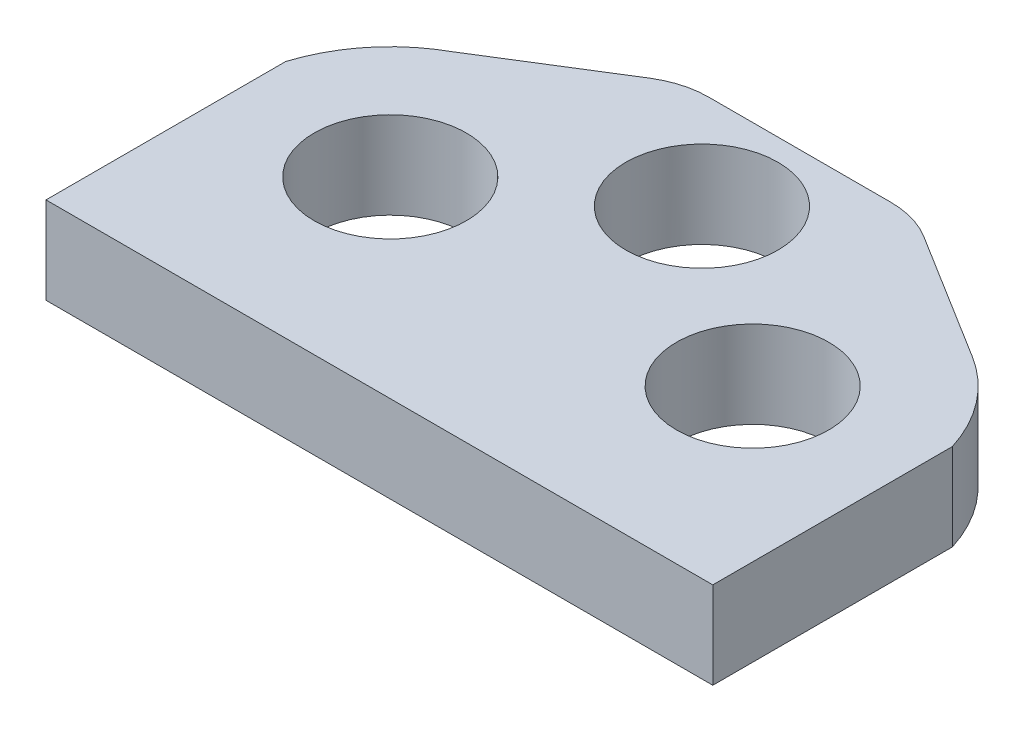
ISO-10303-21;
HEADER;
FILE_DESCRIPTION(('STEP AP214'),'2;1');
FILE_NAME('part.step','',(''),(''),'','','');
FILE_SCHEMA(('AUTOMOTIVE_DESIGN { 1 0 10303 214 1 1 1 1 }'));
ENDSEC;
DATA;
#1=APPLICATION_CONTEXT('core data for automotive mechanical design processes');
#2=APPLICATION_PROTOCOL_DEFINITION('international standard','automotive_design',2000,#1);
#3=PRODUCT_CONTEXT('',#1,'mechanical');
#4=PRODUCT('Part','Part','',(#3));
#5=PRODUCT_RELATED_PRODUCT_CATEGORY('part','',(#4));
#6=PRODUCT_DEFINITION_FORMATION('','',#4);
#7=PRODUCT_DEFINITION_CONTEXT('part definition',#1,'design');
#8=PRODUCT_DEFINITION('design','',#6,#7);
#9=PRODUCT_DEFINITION_SHAPE('','',#8);
#10=(LENGTH_UNIT() NAMED_UNIT(*) SI_UNIT(.MILLI.,.METRE.));
#11=(NAMED_UNIT(*) PLANE_ANGLE_UNIT() SI_UNIT($,.RADIAN.));
#12=(NAMED_UNIT(*) SI_UNIT($,.STERADIAN.) SOLID_ANGLE_UNIT());
#13=UNCERTAINTY_MEASURE_WITH_UNIT(LENGTH_MEASURE(1.E-05),#10,'distance_accuracy_value','');
#14=(GEOMETRIC_REPRESENTATION_CONTEXT(3) GLOBAL_UNCERTAINTY_ASSIGNED_CONTEXT((#13)) GLOBAL_UNIT_ASSIGNED_CONTEXT((#10,
#11,#12)) REPRESENTATION_CONTEXT('',''));
#15=CARTESIAN_POINT('',(0.,0.,0.));
#16=DIRECTION('',(0.,0.,1.));
#17=DIRECTION('',(1.,0.,0.));
#18=AXIS2_PLACEMENT_3D('',#15,#16,#17);
#19=CARTESIAN_POINT('',(46.,12.,-28.));
#20=DIRECTION('',(-1.,0.,0.));
#21=DIRECTION('',(0.,0.,1.));
#22=AXIS2_PLACEMENT_3D('',#19,#20,#21);
#23=PLANE('',#22);
#24=DIRECTION('',(0.,0.,-1.));
#25=VECTOR('',#24,1.);
#26=CARTESIAN_POINT('',(46.,0.,-28.));
#27=LINE('',#26,#25);
#28=CARTESIAN_POINT('',(46.,0.,28.));
#29=VERTEX_POINT('',#28);
#30=CARTESIAN_POINT('',(46.,0.,-5.05743852430174));
#31=VERTEX_POINT('',#30);
#32=EDGE_CURVE('E127',#29,#31,#27,.T.);
#33=ORIENTED_EDGE('',*,*,#32,.T.);
#34=DIRECTION('',(0.,1.,0.));
#35=VECTOR('',#34,1.);
#36=CARTESIAN_POINT('',(46.,-0.000999999999999265,-5.05743852430174));
#37=LINE('',#36,#35);
#38=CARTESIAN_POINT('',(46.,12.,-5.05743852430174));
#39=VERTEX_POINT('',#38);
#40=EDGE_CURVE('E109',#31,#39,#37,.T.);
#41=ORIENTED_EDGE('',*,*,#40,.T.);
#42=DIRECTION('',(0.,0.,-1.));
#43=VECTOR('',#42,1.);
#44=CARTESIAN_POINT('',(46.,12.,-28.));
#45=LINE('',#44,#43);
#46=CARTESIAN_POINT('',(46.,12.,28.));
#47=VERTEX_POINT('',#46);
#48=EDGE_CURVE('E146',#47,#39,#45,.T.);
#49=ORIENTED_EDGE('',*,*,#48,.F.);
#50=DIRECTION('',(0.,-1.,0.));
#51=VECTOR('',#50,1.);
#52=CARTESIAN_POINT('',(46.,12.,28.));
#53=LINE('',#52,#51);
#54=EDGE_CURVE('E133',#47,#29,#53,.T.);
#55=ORIENTED_EDGE('',*,*,#54,.T.);
#56=EDGE_LOOP('',(#33,#41,#49,#55));
#57=FACE_BOUND('',#56,.T.);
#58=ADVANCED_FACE('F32',(#57),#23,.F.);
#59=CARTESIAN_POINT('',(-46.,12.,-28.));
#60=DIRECTION('',(1.,0.,0.));
#61=DIRECTION('',(0.,0.,-1.));
#62=AXIS2_PLACEMENT_3D('',#59,#60,#61);
#63=PLANE('',#62);
#64=DIRECTION('',(0.,0.,1.));
#65=VECTOR('',#64,1.);
#66=CARTESIAN_POINT('',(-46.,12.,-28.));
#67=LINE('',#66,#65);
#68=CARTESIAN_POINT('',(-46.,12.,-5.05743852430096));
#69=VERTEX_POINT('',#68);
#70=CARTESIAN_POINT('',(-46.,12.,28.));
#71=VERTEX_POINT('',#70);
#72=EDGE_CURVE('E187',#69,#71,#67,.T.);
#73=ORIENTED_EDGE('',*,*,#72,.F.);
#74=DIRECTION('',(0.,1.,0.));
#75=VECTOR('',#74,1.);
#76=CARTESIAN_POINT('',(-46.,-0.000999999999999265,-5.05743852430096));
#77=LINE('',#76,#75);
#78=CARTESIAN_POINT('',(-46.,0.,-5.05743852430096));
#79=VERTEX_POINT('',#78);
#80=EDGE_CURVE('E200',#79,#69,#77,.T.);
#81=ORIENTED_EDGE('',*,*,#80,.F.);
#82=DIRECTION('',(0.,0.,1.));
#83=VECTOR('',#82,1.);
#84=CARTESIAN_POINT('',(-46.,0.,-28.));
#85=LINE('',#84,#83);
#86=CARTESIAN_POINT('',(-46.,0.,28.));
#87=VERTEX_POINT('',#86);
#88=EDGE_CURVE('E134',#79,#87,#85,.T.);
#89=ORIENTED_EDGE('',*,*,#88,.T.);
#90=DIRECTION('',(0.,-1.,0.));
#91=VECTOR('',#90,1.);
#92=CARTESIAN_POINT('',(-46.,12.,28.));
#93=LINE('',#92,#91);
#94=EDGE_CURVE('E148',#71,#87,#93,.T.);
#95=ORIENTED_EDGE('',*,*,#94,.F.);
#96=EDGE_LOOP('',(#73,#81,#89,#95));
#97=FACE_BOUND('',#96,.T.);
#98=ADVANCED_FACE('F199',(#97),#63,.F.);
#99=CARTESIAN_POINT('',(-46.,12.,28.));
#100=DIRECTION('',(0.,0.,-1.));
#101=DIRECTION('',(-1.,0.,0.));
#102=AXIS2_PLACEMENT_3D('',#99,#100,#101);
#103=PLANE('',#102);
#104=DIRECTION('',(1.,0.,0.));
#105=VECTOR('',#104,1.);
#106=CARTESIAN_POINT('',(-46.,0.,28.));
#107=LINE('',#106,#105);
#108=EDGE_CURVE('E137',#87,#29,#107,.T.);
#109=ORIENTED_EDGE('',*,*,#108,.T.);
#110=ORIENTED_EDGE('',*,*,#54,.F.);
#111=DIRECTION('',(1.,0.,0.));
#112=VECTOR('',#111,1.);
#113=CARTESIAN_POINT('',(-46.,12.,28.));
#114=LINE('',#113,#112);
#115=EDGE_CURVE('E142',#71,#47,#114,.T.);
#116=ORIENTED_EDGE('',*,*,#115,.F.);
#117=ORIENTED_EDGE('',*,*,#94,.T.);
#118=EDGE_LOOP('',(#109,#110,#116,#117));
#119=FACE_BOUND('',#118,.T.);
#120=ADVANCED_FACE('F193',(#119),#103,.F.);
#121=CARTESIAN_POINT('',(46.,12.,28.));
#122=DIRECTION('',(0.,1.,0.));
#123=DIRECTION('',(0.,0.,1.));
#124=AXIS2_PLACEMENT_3D('',#121,#122,#123);
#125=PLANE('',#124);
#126=CARTESIAN_POINT('',(0.,12.,-16.5));
#127=DIRECTION('',(0.,1.,0.));
#128=DIRECTION('',(0.,0.,1.));
#129=AXIS2_PLACEMENT_3D('',#126,#127,#128);
#130=CIRCLE('',#129,10.5);
#131=CARTESIAN_POINT('',(0.,12.,-5.99999999999999));
#132=VERTEX_POINT('',#131);
#133=EDGE_CURVE('E366',#132,#132,#130,.F.);
#134=ORIENTED_EDGE('',*,*,#133,.T.);
#135=EDGE_LOOP('',(#134));
#136=FACE_BOUND('',#135,.T.);
#137=DIRECTION('',(0.849261821281983,0.,0.527971930042506));
#138=VECTOR('',#137,1.);
#139=CARTESIAN_POINT('',(16.,12.,-30.));
#140=LINE('',#139,#138);
#141=CARTESIAN_POINT('',(18.9096133239769,12.,-28.1911418553838));
#142=VERTEX_POINT('',#141);
#143=CARTESIAN_POINT('',(36.6153824609372,12.,-17.1837600682023));
#144=VERTEX_POINT('',#143);
#145=EDGE_CURVE('E122',#142,#144,#140,.T.);
#146=ORIENTED_EDGE('',*,*,#145,.F.);
#147=CARTESIAN_POINT('',(12.5739501634669,12.,-18.));
#148=DIRECTION('',(0.,1.,0.));
#149=DIRECTION('',(0.,0.,1.));
#150=AXIS2_PLACEMENT_3D('',#147,#148,#149);
#151=CIRCLE('',#150,12.);
#152=CARTESIAN_POINT('',(12.5739501634669,12.,-30.));
#153=VERTEX_POINT('',#152);
#154=EDGE_CURVE('E156',#142,#153,#151,.T.);
#155=ORIENTED_EDGE('',*,*,#154,.T.);
#156=DIRECTION('',(-1.,0.,0.));
#157=VECTOR('',#156,1.);
#158=CARTESIAN_POINT('',(-46.,12.,-30.));
#159=LINE('',#158,#157);
#160=CARTESIAN_POINT('',(-12.56625423062,12.,-30.));
#161=VERTEX_POINT('',#160);
#162=EDGE_CURVE('E139',#153,#161,#159,.T.);
#163=ORIENTED_EDGE('',*,*,#162,.T.);
#164=CARTESIAN_POINT('',(-12.56625423062,12.,-18.));
#165=DIRECTION('',(0.,1.,0.));
#166=DIRECTION('',(0.,0.,1.));
#167=AXIS2_PLACEMENT_3D('',#164,#165,#166);
#168=CIRCLE('',#167,12.);
#169=CARTESIAN_POINT('',(-18.9139974067074,12.,-28.183621977));
#170=VERTEX_POINT('',#169);
#171=EDGE_CURVE('E154',#161,#170,#168,.T.);
#172=ORIENTED_EDGE('',*,*,#171,.T.);
#173=DIRECTION('',(0.848635164749995,0.,-0.52897859800728));
#174=VECTOR('',#173,1.);
#175=CARTESIAN_POINT('',(-16.,12.,-30.));
#176=LINE('',#175,#174);
#177=CARTESIAN_POINT('',(-35.6673041084861,12.,-17.740806195611));
#178=VERTEX_POINT('',#177);
#179=EDGE_CURVE('E208',#178,#170,#176,.T.);
#180=ORIENTED_EDGE('',*,*,#179,.F.);
#181=CARTESIAN_POINT('',(-25.,12.,1.5));
#182=DIRECTION('',(0.,-1.,0.));
#183=DIRECTION('',(0.,0.,-1.));
#184=AXIS2_PLACEMENT_3D('',#181,#182,#183);
#185=CIRCLE('',#184,21.9999999999997);
#186=EDGE_CURVE('E375',#69,#178,#185,.T.);
#187=ORIENTED_EDGE('',*,*,#186,.F.);
#188=ORIENTED_EDGE('',*,*,#72,.T.);
#189=ORIENTED_EDGE('',*,*,#115,.T.);
#190=ORIENTED_EDGE('',*,*,#48,.T.);
#191=CARTESIAN_POINT('',(25.,12.,1.5));
#192=DIRECTION('',(0.,-1.,0.));
#193=DIRECTION('',(0.,0.,1.));
#194=AXIS2_PLACEMENT_3D('',#191,#192,#193);
#195=CIRCLE('',#194,21.9999999999999);
#196=EDGE_CURVE('E116',#144,#39,#195,.T.);
#197=ORIENTED_EDGE('',*,*,#196,.F.);
#198=EDGE_LOOP('',(#146,#155,#163,#172,#180,#187,#188,#189,#190,#197));
#199=FACE_BOUND('',#198,.T.);
#200=CARTESIAN_POINT('',(25.,12.,1.5));
#201=DIRECTION('',(0.,1.,0.));
#202=DIRECTION('',(0.,0.,1.));
#203=AXIS2_PLACEMENT_3D('',#200,#201,#202);
#204=CIRCLE('',#203,10.5);
#205=CARTESIAN_POINT('',(25.,12.,12.));
#206=VERTEX_POINT('',#205);
#207=EDGE_CURVE('E206',#206,#206,#204,.T.);
#208=ORIENTED_EDGE('',*,*,#207,.F.);
#209=EDGE_LOOP('',(#208));
#210=FACE_BOUND('',#209,.T.);
#211=CARTESIAN_POINT('',(-25.,12.,1.5));
#212=DIRECTION('',(0.,1.,0.));
#213=DIRECTION('',(0.,0.,1.));
#214=AXIS2_PLACEMENT_3D('',#211,#212,#213);
#215=CIRCLE('',#214,10.5);
#216=CARTESIAN_POINT('',(-25.,12.,12.));
#217=VERTEX_POINT('',#216);
#218=EDGE_CURVE('E184',#217,#217,#215,.T.);
#219=ORIENTED_EDGE('',*,*,#218,.F.);
#220=EDGE_LOOP('',(#219));
#221=FACE_BOUND('',#220,.T.);
#222=ADVANCED_FACE('F176',(#136,#199,#210,#221),#125,.T.);
#223=CARTESIAN_POINT('',(46.,0.,28.));
#224=DIRECTION('',(0.,1.,0.));
#225=DIRECTION('',(0.,0.,1.));
#226=AXIS2_PLACEMENT_3D('',#223,#224,#225);
#227=PLANE('',#226);
#228=CARTESIAN_POINT('',(0.,0.,-16.5));
#229=DIRECTION('',(0.,-1.,0.));
#230=DIRECTION('',(0.,0.,-1.));
#231=AXIS2_PLACEMENT_3D('',#228,#229,#230);
#232=CIRCLE('',#231,10.5);
#233=CARTESIAN_POINT('',(0.,0.,-27.));
#234=VERTEX_POINT('',#233);
#235=EDGE_CURVE('E170',#234,#234,#232,.T.);
#236=ORIENTED_EDGE('',*,*,#235,.F.);
#237=EDGE_LOOP('',(#236));
#238=FACE_BOUND('',#237,.T.);
#239=CARTESIAN_POINT('',(25.,0.,1.5));
#240=DIRECTION('',(0.,1.,0.));
#241=DIRECTION('',(0.,0.,1.));
#242=AXIS2_PLACEMENT_3D('',#239,#240,#241);
#243=CIRCLE('',#242,10.5);
#244=CARTESIAN_POINT('',(25.,0.,12.));
#245=VERTEX_POINT('',#244);
#246=EDGE_CURVE('E215',#245,#245,#243,.F.);
#247=ORIENTED_EDGE('',*,*,#246,.F.);
#248=EDGE_LOOP('',(#247));
#249=FACE_BOUND('',#248,.T.);
#250=CARTESIAN_POINT('',(-25.,0.,1.5));
#251=DIRECTION('',(0.,1.,0.));
#252=DIRECTION('',(0.,0.,1.));
#253=AXIS2_PLACEMENT_3D('',#250,#251,#252);
#254=CIRCLE('',#253,10.5);
#255=CARTESIAN_POINT('',(-25.,0.,12.));
#256=VERTEX_POINT('',#255);
#257=EDGE_CURVE('E181',#256,#256,#254,.F.);
#258=ORIENTED_EDGE('',*,*,#257,.F.);
#259=EDGE_LOOP('',(#258));
#260=FACE_BOUND('',#259,.T.);
#261=DIRECTION('',(-1.,0.,0.));
#262=VECTOR('',#261,1.);
#263=CARTESIAN_POINT('',(-46.,0.,-30.));
#264=LINE('',#263,#262);
#265=CARTESIAN_POINT('',(12.5739501634669,0.,-30.));
#266=VERTEX_POINT('',#265);
#267=CARTESIAN_POINT('',(-12.56625423062,0.,-30.));
#268=VERTEX_POINT('',#267);
#269=EDGE_CURVE('E135',#266,#268,#264,.T.);
#270=ORIENTED_EDGE('',*,*,#269,.F.);
#271=CARTESIAN_POINT('',(12.5739501634669,0.,-18.));
#272=DIRECTION('',(0.,1.,0.));
#273=DIRECTION('',(0.,0.,1.));
#274=AXIS2_PLACEMENT_3D('',#271,#272,#273);
#275=CIRCLE('',#274,12.);
#276=CARTESIAN_POINT('',(18.9096133239769,0.,-28.1911418553838));
#277=VERTEX_POINT('',#276);
#278=EDGE_CURVE('E40',#266,#277,#275,.F.);
#279=ORIENTED_EDGE('',*,*,#278,.T.);
#280=DIRECTION('',(-0.849261821281983,0.,-0.527971930042506));
#281=VECTOR('',#280,1.);
#282=CARTESIAN_POINT('',(16.,0.,-30.));
#283=LINE('',#282,#281);
#284=CARTESIAN_POINT('',(36.6153824609372,0.,-17.1837600682023));
#285=VERTEX_POINT('',#284);
#286=EDGE_CURVE('E129',#285,#277,#283,.T.);
#287=ORIENTED_EDGE('',*,*,#286,.F.);
#288=CARTESIAN_POINT('',(25.,0.,1.5));
#289=DIRECTION('',(0.,1.,0.));
#290=DIRECTION('',(0.,0.,1.));
#291=AXIS2_PLACEMENT_3D('',#288,#289,#290);
#292=CIRCLE('',#291,21.9999999999999);
#293=EDGE_CURVE('E113',#31,#285,#292,.T.);
#294=ORIENTED_EDGE('',*,*,#293,.F.);
#295=ORIENTED_EDGE('',*,*,#32,.F.);
#296=ORIENTED_EDGE('',*,*,#108,.F.);
#297=ORIENTED_EDGE('',*,*,#88,.F.);
#298=CARTESIAN_POINT('',(-25.,0.,1.5));
#299=DIRECTION('',(0.,1.,0.));
#300=DIRECTION('',(0.,0.,1.));
#301=AXIS2_PLACEMENT_3D('',#298,#299,#300);
#302=CIRCLE('',#301,21.9999999999997);
#303=CARTESIAN_POINT('',(-35.6673041084861,0.,-17.740806195611));
#304=VERTEX_POINT('',#303);
#305=EDGE_CURVE('E196',#304,#79,#302,.T.);
#306=ORIENTED_EDGE('',*,*,#305,.F.);
#307=DIRECTION('',(-0.848635164749996,0.,0.52897859800728));
#308=VECTOR('',#307,1.);
#309=CARTESIAN_POINT('',(-16.,0.,-30.));
#310=LINE('',#309,#308);
#311=CARTESIAN_POINT('',(-18.9139974067074,0.,-28.183621977));
#312=VERTEX_POINT('',#311);
#313=EDGE_CURVE('E203',#312,#304,#310,.T.);
#314=ORIENTED_EDGE('',*,*,#313,.F.);
#315=CARTESIAN_POINT('',(-12.56625423062,0.,-18.));
#316=DIRECTION('',(0.,1.,0.));
#317=DIRECTION('',(0.,0.,1.));
#318=AXIS2_PLACEMENT_3D('',#315,#316,#317);
#319=CIRCLE('',#318,12.);
#320=EDGE_CURVE('E52',#312,#268,#319,.F.);
#321=ORIENTED_EDGE('',*,*,#320,.T.);
#322=EDGE_LOOP('',(#270,#279,#287,#294,#295,#296,#297,#306,#314,#321));
#323=FACE_BOUND('',#322,.T.);
#324=ADVANCED_FACE('F125',(#238,#249,#260,#323),#227,.F.);
#325=CARTESIAN_POINT('',(-46.,0.,-30.));
#326=DIRECTION('',(0.,0.,-1.));
#327=DIRECTION('',(-1.,0.,0.));
#328=AXIS2_PLACEMENT_3D('',#325,#326,#327);
#329=PLANE('',#328);
#330=ORIENTED_EDGE('',*,*,#162,.F.);
#331=DIRECTION('',(0.,1.,0.));
#332=VECTOR('',#331,1.);
#333=CARTESIAN_POINT('',(12.5739501634669,0.,-30.));
#334=LINE('',#333,#332);
#335=EDGE_CURVE('E161',#153,#266,#334,.F.);
#336=ORIENTED_EDGE('',*,*,#335,.T.);
#337=ORIENTED_EDGE('',*,*,#269,.T.);
#338=DIRECTION('',(0.,1.,0.));
#339=VECTOR('',#338,1.);
#340=CARTESIAN_POINT('',(-12.56625423062,12.,-30.));
#341=LINE('',#340,#339);
#342=EDGE_CURVE('E158',#268,#161,#341,.T.);
#343=ORIENTED_EDGE('',*,*,#342,.T.);
#344=EDGE_LOOP('',(#330,#336,#337,#343));
#345=FACE_BOUND('',#344,.T.);
#346=ADVANCED_FACE('F179',(#345),#329,.T.);
#347=CARTESIAN_POINT('',(-25.,-0.000999999999999265,1.5));
#348=DIRECTION('',(0.,1.,0.));
#349=DIRECTION('',(0.,0.,1.));
#350=AXIS2_PLACEMENT_3D('',#347,#348,#349);
#351=CYLINDRICAL_SURFACE('',#350,10.5);
#352=ORIENTED_EDGE('',*,*,#218,.T.);
#353=EDGE_LOOP('',(#352));
#354=FACE_BOUND('',#353,.T.);
#355=ORIENTED_EDGE('',*,*,#257,.T.);
#356=EDGE_LOOP('',(#355));
#357=FACE_BOUND('',#356,.T.);
#358=ADVANCED_FACE('F221',(#354,#357),#351,.F.);
#359=CARTESIAN_POINT('',(25.,-0.000999999999999265,1.5));
#360=DIRECTION('',(0.,1.,0.));
#361=DIRECTION('',(0.,0.,1.));
#362=AXIS2_PLACEMENT_3D('',#359,#360,#361);
#363=CYLINDRICAL_SURFACE('',#362,10.5);
#364=ORIENTED_EDGE('',*,*,#207,.T.);
#365=EDGE_LOOP('',(#364));
#366=FACE_BOUND('',#365,.T.);
#367=ORIENTED_EDGE('',*,*,#246,.T.);
#368=EDGE_LOOP('',(#367));
#369=FACE_BOUND('',#368,.T.);
#370=ADVANCED_FACE('F262',(#366,#369),#363,.F.);
#371=CARTESIAN_POINT('',(-25.,-0.000999999999999265,1.5));
#372=DIRECTION('',(0.,1.,0.));
#373=DIRECTION('',(0.,0.,1.));
#374=AXIS2_PLACEMENT_3D('',#371,#372,#373);
#375=CYLINDRICAL_SURFACE('',#374,21.9999999999997);
#376=ORIENTED_EDGE('',*,*,#305,.T.);
#377=ORIENTED_EDGE('',*,*,#80,.T.);
#378=ORIENTED_EDGE('',*,*,#186,.T.);
#379=DIRECTION('',(0.,1.,0.));
#380=VECTOR('',#379,1.);
#381=CARTESIAN_POINT('',(-35.6673041084861,-0.000999999999999265,-17.740806195611));
#382=LINE('',#381,#380);
#383=EDGE_CURVE('E204',#304,#178,#382,.T.);
#384=ORIENTED_EDGE('',*,*,#383,.F.);
#385=EDGE_LOOP('',(#376,#377,#378,#384));
#386=FACE_BOUND('',#385,.T.);
#387=ADVANCED_FACE('F259',(#386),#375,.T.);
#388=CARTESIAN_POINT('',(-16.,-0.000999999999999265,-30.));
#389=DIRECTION('',(0.52897859800728,0.,0.848635164749996));
#390=DIRECTION('',(0.848635164749996,0.,-0.52897859800728));
#391=AXIS2_PLACEMENT_3D('',#388,#389,#390);
#392=PLANE('',#391);
#393=ORIENTED_EDGE('',*,*,#179,.T.);
#394=DIRECTION('',(0.,1.,0.));
#395=VECTOR('',#394,1.);
#396=CARTESIAN_POINT('',(-18.9139974067074,0.,-28.183621977));
#397=LINE('',#396,#395);
#398=EDGE_CURVE('E11',#170,#312,#397,.F.);
#399=ORIENTED_EDGE('',*,*,#398,.T.);
#400=ORIENTED_EDGE('',*,*,#313,.T.);
#401=ORIENTED_EDGE('',*,*,#383,.T.);
#402=EDGE_LOOP('',(#393,#399,#400,#401));
#403=FACE_BOUND('',#402,.T.);
#404=ADVANCED_FACE('F253',(#403),#392,.F.);
#405=CARTESIAN_POINT('',(25.,-0.000999999999999265,1.5));
#406=DIRECTION('',(0.,1.,0.));
#407=DIRECTION('',(0.,0.,1.));
#408=AXIS2_PLACEMENT_3D('',#405,#406,#407);
#409=CYLINDRICAL_SURFACE('',#408,21.9999999999999);
#410=ORIENTED_EDGE('',*,*,#293,.T.);
#411=DIRECTION('',(0.,1.,0.));
#412=VECTOR('',#411,1.);
#413=CARTESIAN_POINT('',(36.6153824609372,-0.000999999999999265,-17.1837600682023));
#414=LINE('',#413,#412);
#415=EDGE_CURVE('E121',#285,#144,#414,.T.);
#416=ORIENTED_EDGE('',*,*,#415,.T.);
#417=ORIENTED_EDGE('',*,*,#196,.T.);
#418=ORIENTED_EDGE('',*,*,#40,.F.);
#419=EDGE_LOOP('',(#410,#416,#417,#418));
#420=FACE_BOUND('',#419,.T.);
#421=ADVANCED_FACE('F111',(#420),#409,.T.);
#422=CARTESIAN_POINT('',(16.,-0.000999999999999265,-30.));
#423=DIRECTION('',(-0.527971930042506,0.,0.849261821281983));
#424=DIRECTION('',(0.849261821281983,0.,0.527971930042506));
#425=AXIS2_PLACEMENT_3D('',#422,#423,#424);
#426=PLANE('',#425);
#427=ORIENTED_EDGE('',*,*,#286,.T.);
#428=DIRECTION('',(0.,1.,0.));
#429=VECTOR('',#428,1.);
#430=CARTESIAN_POINT('',(18.9096133239769,12.,-28.1911418553838));
#431=LINE('',#430,#429);
#432=EDGE_CURVE('E151',#277,#142,#431,.T.);
#433=ORIENTED_EDGE('',*,*,#432,.T.);
#434=ORIENTED_EDGE('',*,*,#145,.T.);
#435=ORIENTED_EDGE('',*,*,#415,.F.);
#436=EDGE_LOOP('',(#427,#433,#434,#435));
#437=FACE_BOUND('',#436,.T.);
#438=ADVANCED_FACE('F168',(#437),#426,.F.);
#439=CARTESIAN_POINT('',(12.5739501634669,-0.000999999999999265,-18.));
#440=DIRECTION('',(0.,-1.,0.));
#441=DIRECTION('',(0.,0.,-1.));
#442=AXIS2_PLACEMENT_3D('',#439,#440,#441);
#443=CYLINDRICAL_SURFACE('',#442,12.);
#444=ORIENTED_EDGE('',*,*,#278,.F.);
#445=ORIENTED_EDGE('',*,*,#335,.F.);
#446=ORIENTED_EDGE('',*,*,#154,.F.);
#447=ORIENTED_EDGE('',*,*,#432,.F.);
#448=EDGE_LOOP('',(#444,#445,#446,#447));
#449=FACE_BOUND('',#448,.T.);
#450=ADVANCED_FACE('F172',(#449),#443,.T.);
#451=CARTESIAN_POINT('',(-12.56625423062,0.,-18.));
#452=DIRECTION('',(0.,-1.,0.));
#453=DIRECTION('',(0.,0.,-1.));
#454=AXIS2_PLACEMENT_3D('',#451,#452,#453);
#455=CYLINDRICAL_SURFACE('',#454,12.);
#456=ORIENTED_EDGE('',*,*,#320,.F.);
#457=ORIENTED_EDGE('',*,*,#398,.F.);
#458=ORIENTED_EDGE('',*,*,#171,.F.);
#459=ORIENTED_EDGE('',*,*,#342,.F.);
#460=EDGE_LOOP('',(#456,#457,#458,#459));
#461=FACE_BOUND('',#460,.T.);
#462=ADVANCED_FACE('F34',(#461),#455,.T.);
#463=CARTESIAN_POINT('',(0.,12.001,-16.5));
#464=DIRECTION('',(0.,-1.,0.));
#465=DIRECTION('',(0.,0.,-1.));
#466=AXIS2_PLACEMENT_3D('',#463,#464,#465);
#467=CYLINDRICAL_SURFACE('',#466,10.5);
#468=ORIENTED_EDGE('',*,*,#133,.F.);
#469=EDGE_LOOP('',(#468));
#470=FACE_BOUND('',#469,.T.);
#471=ORIENTED_EDGE('',*,*,#235,.T.);
#472=EDGE_LOOP('',(#471));
#473=FACE_BOUND('',#472,.T.);
#474=ADVANCED_FACE('F247',(#470,#473),#467,.F.);
#475=CLOSED_SHELL('',(#58,#98,#120,#222,#324,#346,#358,#370,#387,#404,#421,#438,#450,#462,#474));
#476=MANIFOLD_SOLID_BREP('B2',#475);
#477=ADVANCED_BREP_SHAPE_REPRESENTATION('',(#18,#476),#14);
#478=SHAPE_DEFINITION_REPRESENTATION(#9,#477);
ENDSEC;
END-ISO-10303-21;
